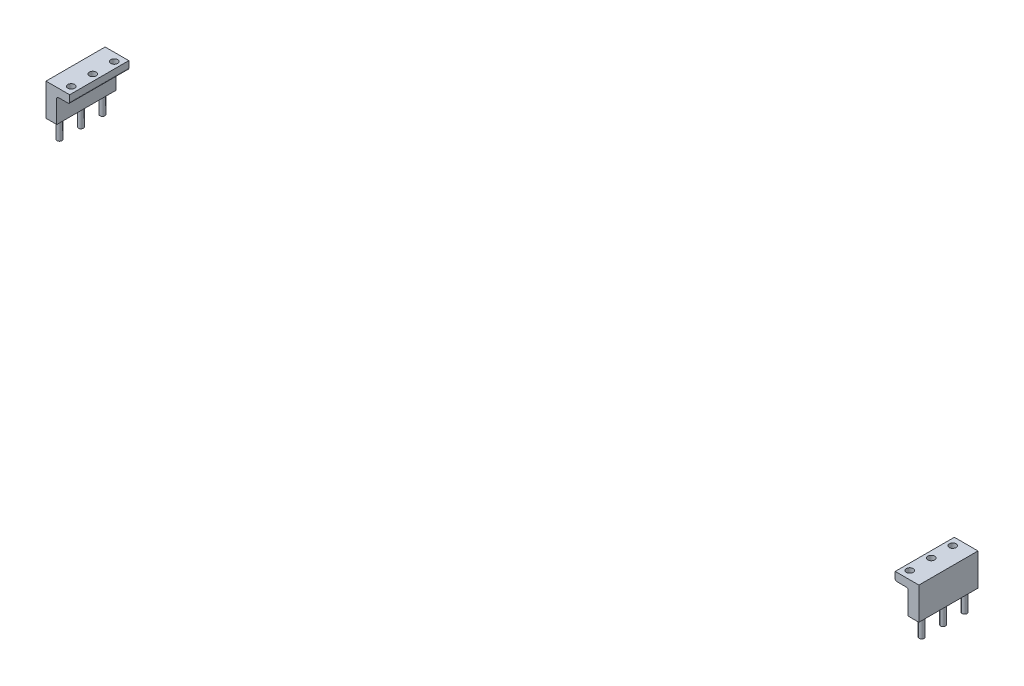
ISO-10303-21;
HEADER;
FILE_DESCRIPTION(('STEP AP214'),'2;1');
FILE_NAME('part.step','',(''),(''),'','','');
FILE_SCHEMA(('AUTOMOTIVE_DESIGN { 1 0 10303 214 1 1 1 1 }'));
ENDSEC;
DATA;
#1=APPLICATION_CONTEXT('core data for automotive mechanical design processes');
#2=APPLICATION_PROTOCOL_DEFINITION('international standard','automotive_design',2000,#1);
#3=PRODUCT_CONTEXT('',#1,'mechanical');
#4=PRODUCT('Part','Part','',(#3));
#5=PRODUCT_RELATED_PRODUCT_CATEGORY('part','',(#4));
#6=PRODUCT_DEFINITION_FORMATION('','',#4);
#7=PRODUCT_DEFINITION_CONTEXT('part definition',#1,'design');
#8=PRODUCT_DEFINITION('design','',#6,#7);
#9=PRODUCT_DEFINITION_SHAPE('','',#8);
#10=(LENGTH_UNIT() NAMED_UNIT(*) SI_UNIT(.MILLI.,.METRE.));
#11=(NAMED_UNIT(*) PLANE_ANGLE_UNIT() SI_UNIT($,.RADIAN.));
#12=(NAMED_UNIT(*) SI_UNIT($,.STERADIAN.) SOLID_ANGLE_UNIT());
#13=UNCERTAINTY_MEASURE_WITH_UNIT(LENGTH_MEASURE(1.E-05),#10,'distance_accuracy_value','');
#14=(GEOMETRIC_REPRESENTATION_CONTEXT(3) GLOBAL_UNCERTAINTY_ASSIGNED_CONTEXT((#13)) GLOBAL_UNIT_ASSIGNED_CONTEXT((#10,
#11,#12)) REPRESENTATION_CONTEXT('',''));
#15=CARTESIAN_POINT('',(0.,0.,0.));
#16=DIRECTION('',(0.,0.,1.));
#17=DIRECTION('',(1.,0.,0.));
#18=AXIS2_PLACEMENT_3D('',#15,#16,#17);
#19=CARTESIAN_POINT('',(514.25475,-81.3562,76.2));
#20=DIRECTION('',(0.,1.,0.));
#21=DIRECTION('',(0.,0.,1.));
#22=AXIS2_PLACEMENT_3D('',#19,#20,#21);
#23=PLANE('',#22);
#24=CARTESIAN_POINT('',(514.985,-81.3562,76.2));
#25=DIRECTION('',(0.,1.,0.));
#26=DIRECTION('',(0.,0.,-1.));
#27=AXIS2_PLACEMENT_3D('',#24,#25,#26);
#28=CIRCLE('',#27,1.4605);
#29=CARTESIAN_POINT('',(514.985,-81.3562,74.7395));
#30=VERTEX_POINT('',#29);
#31=EDGE_CURVE('P0_E11',#30,#30,#28,.T.);
#32=ORIENTED_EDGE('',*,*,#31,.F.);
#33=EDGE_LOOP('',(#32));
#34=FACE_BOUND('',#33,.T.);
#35=ADVANCED_FACE('P0_F17',(#34),#23,.F.);
#36=CARTESIAN_POINT('',(514.985,-75.6031,76.2));
#37=DIRECTION('',(0.,-1.,0.));
#38=DIRECTION('',(0.,0.,-1.));
#39=AXIS2_PLACEMENT_3D('',#36,#37,#38);
#40=CYLINDRICAL_SURFACE('',#39,1.4605);
#41=ORIENTED_EDGE('',*,*,#31,.T.);
#42=EDGE_LOOP('',(#41));
#43=FACE_BOUND('',#42,.T.);
#44=CARTESIAN_POINT('',(514.985,-71.12,76.2));
#45=DIRECTION('',(0.,1.,0.));
#46=DIRECTION('',(0.,0.,-1.));
#47=AXIS2_PLACEMENT_3D('',#44,#45,#46);
#48=CIRCLE('',#47,1.4605);
#49=CARTESIAN_POINT('',(514.985,-71.12,74.7395));
#50=VERTEX_POINT('',#49);
#51=EDGE_CURVE('P0_E164',#50,#50,#48,.T.);
#52=ORIENTED_EDGE('',*,*,#51,.F.);
#53=EDGE_LOOP('',(#52));
#54=FACE_BOUND('',#53,.T.);
#55=ADVANCED_FACE('P0_F175',(#43,#54),#40,.T.);
#56=CARTESIAN_POINT('',(514.985,-69.85,76.2));
#57=DIRECTION('',(0.,1.,0.));
#58=DIRECTION('',(0.,0.,1.));
#59=AXIS2_PLACEMENT_3D('',#56,#57,#58);
#60=CONICAL_SURFACE('',#59,2.7686,0.800175412804941);
#61=ORIENTED_EDGE('',*,*,#51,.T.);
#62=EDGE_LOOP('',(#61));
#63=FACE_BOUND('',#62,.T.);
#64=CARTESIAN_POINT('',(514.985,-69.85,76.2));
#65=DIRECTION('',(0.,1.,0.));
#66=DIRECTION('',(0.,0.,-1.));
#67=AXIS2_PLACEMENT_3D('',#64,#65,#66);
#68=CIRCLE('',#67,2.7686);
#69=CARTESIAN_POINT('',(514.985,-69.85,73.4314));
#70=VERTEX_POINT('',#69);
#71=EDGE_CURVE('P0_E24',#70,#70,#68,.T.);
#72=ORIENTED_EDGE('',*,*,#71,.F.);
#73=EDGE_LOOP('',(#72));
#74=FACE_BOUND('',#73,.T.);
#75=ADVANCED_FACE('P0_F172',(#63,#74),#60,.T.);
#76=CARTESIAN_POINT('',(514.25475,-81.3562,88.9));
#77=DIRECTION('',(0.,1.,0.));
#78=DIRECTION('',(0.,0.,1.));
#79=AXIS2_PLACEMENT_3D('',#76,#77,#78);
#80=PLANE('',#79);
#81=CARTESIAN_POINT('',(514.985,-81.3562,88.9));
#82=DIRECTION('',(0.,1.,0.));
#83=DIRECTION('',(0.,0.,-1.));
#84=AXIS2_PLACEMENT_3D('',#81,#82,#83);
#85=CIRCLE('',#84,1.4605);
#86=CARTESIAN_POINT('',(514.985,-81.3562,87.4395));
#87=VERTEX_POINT('',#86);
#88=EDGE_CURVE('P0_E161',#87,#87,#85,.T.);
#89=ORIENTED_EDGE('',*,*,#88,.F.);
#90=EDGE_LOOP('',(#89));
#91=FACE_BOUND('',#90,.T.);
#92=ADVANCED_FACE('P0_F174',(#91),#80,.F.);
#93=CARTESIAN_POINT('',(514.985,-75.6031,88.9));
#94=DIRECTION('',(0.,-1.,0.));
#95=DIRECTION('',(0.,0.,-1.));
#96=AXIS2_PLACEMENT_3D('',#93,#94,#95);
#97=CYLINDRICAL_SURFACE('',#96,1.4605);
#98=ORIENTED_EDGE('',*,*,#88,.T.);
#99=EDGE_LOOP('',(#98));
#100=FACE_BOUND('',#99,.T.);
#101=CARTESIAN_POINT('',(514.985,-71.12,88.9));
#102=DIRECTION('',(0.,1.,0.));
#103=DIRECTION('',(0.,0.,-1.));
#104=AXIS2_PLACEMENT_3D('',#101,#102,#103);
#105=CIRCLE('',#104,1.4605);
#106=CARTESIAN_POINT('',(514.985,-71.12,87.4395));
#107=VERTEX_POINT('',#106);
#108=EDGE_CURVE('P0_E155',#107,#107,#105,.T.);
#109=ORIENTED_EDGE('',*,*,#108,.F.);
#110=EDGE_LOOP('',(#109));
#111=FACE_BOUND('',#110,.T.);
#112=ADVANCED_FACE('P0_F183',(#100,#111),#97,.T.);
#113=CARTESIAN_POINT('',(514.985,-69.85,88.9));
#114=DIRECTION('',(0.,1.,0.));
#115=DIRECTION('',(0.,0.,1.));
#116=AXIS2_PLACEMENT_3D('',#113,#114,#115);
#117=CONICAL_SURFACE('',#116,2.7686,0.800175412804941);
#118=ORIENTED_EDGE('',*,*,#108,.T.);
#119=EDGE_LOOP('',(#118));
#120=FACE_BOUND('',#119,.T.);
#121=CARTESIAN_POINT('',(514.985,-69.85,88.9));
#122=DIRECTION('',(0.,1.,0.));
#123=DIRECTION('',(0.,0.,-1.));
#124=AXIS2_PLACEMENT_3D('',#121,#122,#123);
#125=CIRCLE('',#124,2.7686);
#126=CARTESIAN_POINT('',(514.985,-69.85,86.1314));
#127=VERTEX_POINT('',#126);
#128=EDGE_CURVE('P0_E158',#127,#127,#125,.T.);
#129=ORIENTED_EDGE('',*,*,#128,.F.);
#130=EDGE_LOOP('',(#129));
#131=FACE_BOUND('',#130,.T.);
#132=ADVANCED_FACE('P0_F216',(#120,#131),#117,.T.);
#133=CARTESIAN_POINT('',(504.19,-53.18125,106.3625));
#134=DIRECTION('',(1.,0.,0.));
#135=DIRECTION('',(0.,0.,1.));
#136=AXIS2_PLACEMENT_3D('',#133,#134,#135);
#137=PLANE('',#136);
#138=DIRECTION('',(0.,1.,0.));
#139=VECTOR('',#138,1.);
#140=CARTESIAN_POINT('',(504.19,-53.18125,106.3625));
#141=LINE('',#140,#139);
#142=CARTESIAN_POINT('',(504.19,-54.7243,106.3625));
#143=VERTEX_POINT('',#142);
#144=CARTESIAN_POINT('',(504.19,-50.8,106.3625));
#145=VERTEX_POINT('',#144);
#146=EDGE_CURVE('P0_E82',#143,#145,#141,.T.);
#147=ORIENTED_EDGE('',*,*,#146,.T.);
#148=DIRECTION('',(0.,0.,-1.));
#149=VECTOR('',#148,1.);
#150=CARTESIAN_POINT('',(504.19,-50.8,106.3625));
#151=LINE('',#150,#149);
#152=CARTESIAN_POINT('',(504.19,-50.8,71.4375));
#153=VERTEX_POINT('',#152);
#154=EDGE_CURVE('P0_E90',#145,#153,#151,.T.);
#155=ORIENTED_EDGE('',*,*,#154,.T.);
#156=DIRECTION('',(0.,1.,0.));
#157=VECTOR('',#156,1.);
#158=CARTESIAN_POINT('',(504.19,-53.18125,71.4375));
#159=LINE('',#158,#157);
#160=CARTESIAN_POINT('',(504.19,-54.7243,71.4375));
#161=VERTEX_POINT('',#160);
#162=EDGE_CURVE('P0_E123',#161,#153,#159,.T.);
#163=ORIENTED_EDGE('',*,*,#162,.F.);
#164=DIRECTION('',(0.,0.,-1.));
#165=VECTOR('',#164,1.);
#166=CARTESIAN_POINT('',(504.19,-54.7243,106.3625));
#167=LINE('',#166,#165);
#168=EDGE_CURVE('P0_E97',#143,#161,#167,.T.);
#169=ORIENTED_EDGE('',*,*,#168,.F.);
#170=EDGE_LOOP('',(#147,#155,#163,#169));
#171=FACE_BOUND('',#170,.T.);
#172=ADVANCED_FACE('P0_F101',(#171),#137,.F.);
#173=CARTESIAN_POINT('',(511.175,-50.8,106.3625));
#174=DIRECTION('',(0.,-1.,0.));
#175=DIRECTION('',(0.,0.,-1.));
#176=AXIS2_PLACEMENT_3D('',#173,#174,#175);
#177=PLANE('',#176);
#178=CARTESIAN_POINT('',(508.,-50.8,101.6));
#179=DIRECTION('',(0.,1.,0.));
#180=DIRECTION('',(0.,0.,-1.));
#181=AXIS2_PLACEMENT_3D('',#178,#179,#180);
#182=CIRCLE('',#181,1.9939);
#183=CARTESIAN_POINT('',(508.,-50.8,99.6061));
#184=VERTEX_POINT('',#183);
#185=EDGE_CURVE('P0_E109',#184,#184,#182,.T.);
#186=ORIENTED_EDGE('',*,*,#185,.F.);
#187=EDGE_LOOP('',(#186));
#188=FACE_BOUND('',#187,.T.);
#189=CARTESIAN_POINT('',(508.,-50.8,88.9));
#190=DIRECTION('',(0.,1.,0.));
#191=DIRECTION('',(0.,0.,-1.));
#192=AXIS2_PLACEMENT_3D('',#189,#190,#191);
#193=CIRCLE('',#192,1.9939);
#194=CARTESIAN_POINT('',(508.,-50.8,86.9061));
#195=VERTEX_POINT('',#194);
#196=EDGE_CURVE('P0_E371',#195,#195,#193,.T.);
#197=ORIENTED_EDGE('',*,*,#196,.F.);
#198=EDGE_LOOP('',(#197));
#199=FACE_BOUND('',#198,.T.);
#200=CARTESIAN_POINT('',(508.,-50.8,76.2));
#201=DIRECTION('',(0.,1.,0.));
#202=DIRECTION('',(0.,0.,-1.));
#203=AXIS2_PLACEMENT_3D('',#200,#201,#202);
#204=CIRCLE('',#203,1.9939);
#205=CARTESIAN_POINT('',(508.,-50.8,74.2061));
#206=VERTEX_POINT('',#205);
#207=EDGE_CURVE('P0_E364',#206,#206,#204,.T.);
#208=ORIENTED_EDGE('',*,*,#207,.F.);
#209=EDGE_LOOP('',(#208));
#210=FACE_BOUND('',#209,.T.);
#211=DIRECTION('',(1.,0.,0.));
#212=VECTOR('',#211,1.);
#213=CARTESIAN_POINT('',(511.175,-50.8,71.4375));
#214=LINE('',#213,#212);
#215=CARTESIAN_POINT('',(518.16,-50.8,71.4375));
#216=VERTEX_POINT('',#215);
#217=EDGE_CURVE('P0_E93',#153,#216,#214,.T.);
#218=ORIENTED_EDGE('',*,*,#217,.F.);
#219=ORIENTED_EDGE('',*,*,#154,.F.);
#220=DIRECTION('',(1.,0.,0.));
#221=VECTOR('',#220,1.);
#222=CARTESIAN_POINT('',(511.175,-50.8,106.3625));
#223=LINE('',#222,#221);
#224=CARTESIAN_POINT('',(518.16,-50.8,106.3625));
#225=VERTEX_POINT('',#224);
#226=EDGE_CURVE('P0_E78',#145,#225,#223,.T.);
#227=ORIENTED_EDGE('',*,*,#226,.T.);
#228=DIRECTION('',(0.,0.,-1.));
#229=VECTOR('',#228,1.);
#230=CARTESIAN_POINT('',(518.16,-50.8,106.3625));
#231=LINE('',#230,#229);
#232=EDGE_CURVE('P0_E98',#225,#216,#231,.T.);
#233=ORIENTED_EDGE('',*,*,#232,.T.);
#234=EDGE_LOOP('',(#218,#219,#227,#233));
#235=FACE_BOUND('',#234,.T.);
#236=ADVANCED_FACE('P0_F91',(#188,#199,#210,#235),#177,.F.);
#237=CARTESIAN_POINT('',(518.16,-60.325,106.3625));
#238=DIRECTION('',(-1.,0.,0.));
#239=DIRECTION('',(0.,1.,0.));
#240=AXIS2_PLACEMENT_3D('',#237,#238,#239);
#241=PLANE('',#240);
#242=DIRECTION('',(0.,-1.,0.));
#243=VECTOR('',#242,1.);
#244=CARTESIAN_POINT('',(518.16,-60.325,71.4375));
#245=LINE('',#244,#243);
#246=CARTESIAN_POINT('',(518.16,-69.85,71.4375));
#247=VERTEX_POINT('',#246);
#248=EDGE_CURVE('P0_E126',#216,#247,#245,.T.);
#249=ORIENTED_EDGE('',*,*,#248,.F.);
#250=ORIENTED_EDGE('',*,*,#232,.F.);
#251=DIRECTION('',(0.,-1.,0.));
#252=VECTOR('',#251,1.);
#253=CARTESIAN_POINT('',(518.16,-60.325,106.3625));
#254=LINE('',#253,#252);
#255=CARTESIAN_POINT('',(518.16,-69.85,106.3625));
#256=VERTEX_POINT('',#255);
#257=EDGE_CURVE('P0_E84',#225,#256,#254,.T.);
#258=ORIENTED_EDGE('',*,*,#257,.T.);
#259=DIRECTION('',(0.,0.,-1.));
#260=VECTOR('',#259,1.);
#261=CARTESIAN_POINT('',(518.16,-69.85,106.3625));
#262=LINE('',#261,#260);
#263=EDGE_CURVE('P0_E136',#256,#247,#262,.T.);
#264=ORIENTED_EDGE('',*,*,#263,.T.);
#265=EDGE_LOOP('',(#249,#250,#258,#264));
#266=FACE_BOUND('',#265,.T.);
#267=ADVANCED_FACE('P0_F237',(#266),#241,.F.);
#268=CARTESIAN_POINT('',(514.985,-69.85,106.3625));
#269=DIRECTION('',(0.,1.,0.));
#270=DIRECTION('',(0.,0.,1.));
#271=AXIS2_PLACEMENT_3D('',#268,#269,#270);
#272=PLANE('',#271);
#273=ORIENTED_EDGE('',*,*,#71,.T.);
#274=EDGE_LOOP('',(#273));
#275=FACE_BOUND('',#274,.T.);
#276=ORIENTED_EDGE('',*,*,#128,.T.);
#277=EDGE_LOOP('',(#276));
#278=FACE_BOUND('',#277,.T.);
#279=CARTESIAN_POINT('',(514.985,-69.85,101.6));
#280=DIRECTION('',(0.,1.,0.));
#281=DIRECTION('',(0.,0.,-1.));
#282=AXIS2_PLACEMENT_3D('',#279,#280,#281);
#283=CIRCLE('',#282,2.7686);
#284=CARTESIAN_POINT('',(514.985,-69.85,98.8314));
#285=VERTEX_POINT('',#284);
#286=EDGE_CURVE('P0_E154',#285,#285,#283,.T.);
#287=ORIENTED_EDGE('',*,*,#286,.T.);
#288=EDGE_LOOP('',(#287));
#289=FACE_BOUND('',#288,.T.);
#290=DIRECTION('',(-1.,0.,0.));
#291=VECTOR('',#290,1.);
#292=CARTESIAN_POINT('',(514.985,-69.85,71.4375));
#293=LINE('',#292,#291);
#294=CARTESIAN_POINT('',(511.81,-69.85,71.4375));
#295=VERTEX_POINT('',#294);
#296=EDGE_CURVE('P0_E129',#247,#295,#293,.T.);
#297=ORIENTED_EDGE('',*,*,#296,.F.);
#298=ORIENTED_EDGE('',*,*,#263,.F.);
#299=DIRECTION('',(-1.,0.,0.));
#300=VECTOR('',#299,1.);
#301=CARTESIAN_POINT('',(514.985,-69.85,106.3625));
#302=LINE('',#301,#300);
#303=CARTESIAN_POINT('',(511.81,-69.85,106.3625));
#304=VERTEX_POINT('',#303);
#305=EDGE_CURVE('P0_E113',#256,#304,#302,.T.);
#306=ORIENTED_EDGE('',*,*,#305,.T.);
#307=DIRECTION('',(0.,0.,-1.));
#308=VECTOR('',#307,1.);
#309=CARTESIAN_POINT('',(511.81,-69.85,106.3625));
#310=LINE('',#309,#308);
#311=EDGE_CURVE('P0_E122',#304,#295,#310,.T.);
#312=ORIENTED_EDGE('',*,*,#311,.T.);
#313=EDGE_LOOP('',(#297,#298,#306,#312));
#314=FACE_BOUND('',#313,.T.);
#315=ADVANCED_FACE('P0_F169',(#275,#278,#289,#314),#272,.F.);
#316=CARTESIAN_POINT('',(511.81,-62.70625,106.3625));
#317=DIRECTION('',(1.,0.,0.));
#318=DIRECTION('',(0.,0.,1.));
#319=AXIS2_PLACEMENT_3D('',#316,#317,#318);
#320=PLANE('',#319);
#321=DIRECTION('',(0.,1.,0.));
#322=VECTOR('',#321,1.);
#323=CARTESIAN_POINT('',(511.81,-62.70625,71.4375));
#324=LINE('',#323,#322);
#325=CARTESIAN_POINT('',(511.81,-56.4007,71.4375));
#326=VERTEX_POINT('',#325);
#327=EDGE_CURVE('P0_E106',#295,#326,#324,.T.);
#328=ORIENTED_EDGE('',*,*,#327,.F.);
#329=ORIENTED_EDGE('',*,*,#311,.F.);
#330=DIRECTION('',(0.,1.,0.));
#331=VECTOR('',#330,1.);
#332=CARTESIAN_POINT('',(511.81,-62.70625,106.3625));
#333=LINE('',#332,#331);
#334=CARTESIAN_POINT('',(511.81,-56.4007,106.3625));
#335=VERTEX_POINT('',#334);
#336=EDGE_CURVE('P0_E116',#304,#335,#333,.T.);
#337=ORIENTED_EDGE('',*,*,#336,.T.);
#338=DIRECTION('',(0.,0.,-1.));
#339=VECTOR('',#338,1.);
#340=CARTESIAN_POINT('',(511.81,-56.4007,106.3625));
#341=LINE('',#340,#339);
#342=EDGE_CURVE('P0_E149',#326,#335,#341,.F.);
#343=ORIENTED_EDGE('',*,*,#342,.F.);
#344=EDGE_LOOP('',(#328,#329,#337,#343));
#345=FACE_BOUND('',#344,.T.);
#346=ADVANCED_FACE('P0_F252',(#345),#320,.F.);
#347=CARTESIAN_POINT('',(508.,-55.5625,106.3625));
#348=DIRECTION('',(0.,1.,0.));
#349=DIRECTION('',(0.,0.,1.));
#350=AXIS2_PLACEMENT_3D('',#347,#348,#349);
#351=PLANE('',#350);
#352=CARTESIAN_POINT('',(508.,-55.5625,101.6));
#353=DIRECTION('',(0.,1.,0.));
#354=DIRECTION('',(0.,0.,-1.));
#355=AXIS2_PLACEMENT_3D('',#352,#353,#354);
#356=CIRCLE('',#355,1.9939);
#357=CARTESIAN_POINT('',(508.,-55.5625,99.6061));
#358=VERTEX_POINT('',#357);
#359=EDGE_CURVE('P0_E361',#358,#358,#356,.T.);
#360=ORIENTED_EDGE('',*,*,#359,.T.);
#361=EDGE_LOOP('',(#360));
#362=FACE_BOUND('',#361,.T.);
#363=CARTESIAN_POINT('',(508.,-55.5625,88.9));
#364=DIRECTION('',(0.,1.,0.));
#365=DIRECTION('',(0.,0.,-1.));
#366=AXIS2_PLACEMENT_3D('',#363,#364,#365);
#367=CIRCLE('',#366,1.9939);
#368=CARTESIAN_POINT('',(508.,-55.5625,86.9061));
#369=VERTEX_POINT('',#368);
#370=EDGE_CURVE('P0_E365',#369,#369,#367,.T.);
#371=ORIENTED_EDGE('',*,*,#370,.T.);
#372=EDGE_LOOP('',(#371));
#373=FACE_BOUND('',#372,.T.);
#374=CARTESIAN_POINT('',(508.,-55.5625,76.2));
#375=DIRECTION('',(0.,1.,0.));
#376=DIRECTION('',(0.,0.,-1.));
#377=AXIS2_PLACEMENT_3D('',#374,#375,#376);
#378=CIRCLE('',#377,1.9939);
#379=CARTESIAN_POINT('',(508.,-55.5625,74.2061));
#380=VERTEX_POINT('',#379);
#381=EDGE_CURVE('P0_E360',#380,#380,#378,.T.);
#382=ORIENTED_EDGE('',*,*,#381,.T.);
#383=EDGE_LOOP('',(#382));
#384=FACE_BOUND('',#383,.T.);
#385=DIRECTION('',(-1.,0.,0.));
#386=VECTOR('',#385,1.);
#387=CARTESIAN_POINT('',(508.,-55.5625,71.4375));
#388=LINE('',#387,#386);
#389=CARTESIAN_POINT('',(510.9718,-55.5625,71.4375));
#390=VERTEX_POINT('',#389);
#391=CARTESIAN_POINT('',(505.0282,-55.5625,71.4375));
#392=VERTEX_POINT('',#391);
#393=EDGE_CURVE('P0_E103',#390,#392,#388,.T.);
#394=ORIENTED_EDGE('',*,*,#393,.F.);
#395=DIRECTION('',(0.,0.,-1.));
#396=VECTOR('',#395,1.);
#397=CARTESIAN_POINT('',(510.9718,-55.5625,71.4375));
#398=LINE('',#397,#396);
#399=CARTESIAN_POINT('',(510.9718,-55.5625,106.3625));
#400=VERTEX_POINT('',#399);
#401=EDGE_CURVE('P0_E143',#400,#390,#398,.T.);
#402=ORIENTED_EDGE('',*,*,#401,.F.);
#403=DIRECTION('',(-1.,0.,0.));
#404=VECTOR('',#403,1.);
#405=CARTESIAN_POINT('',(508.,-55.5625,106.3625));
#406=LINE('',#405,#404);
#407=CARTESIAN_POINT('',(505.0282,-55.5625,106.3625));
#408=VERTEX_POINT('',#407);
#409=EDGE_CURVE('P0_E119',#400,#408,#406,.T.);
#410=ORIENTED_EDGE('',*,*,#409,.T.);
#411=DIRECTION('',(0.,0.,-1.));
#412=VECTOR('',#411,1.);
#413=CARTESIAN_POINT('',(505.0282,-55.5625,106.3625));
#414=LINE('',#413,#412);
#415=EDGE_CURVE('P0_E146',#392,#408,#414,.F.);
#416=ORIENTED_EDGE('',*,*,#415,.F.);
#417=EDGE_LOOP('',(#394,#402,#410,#416));
#418=FACE_BOUND('',#417,.T.);
#419=ADVANCED_FACE('P0_F259',(#362,#373,#384,#418),#351,.F.);
#420=CARTESIAN_POINT('',(511.175,-60.325,106.3625));
#421=DIRECTION('',(0.,0.,1.));
#422=DIRECTION('',(-1.,0.,0.));
#423=AXIS2_PLACEMENT_3D('',#420,#421,#422);
#424=PLANE('',#423);
#425=ORIENTED_EDGE('',*,*,#409,.F.);
#426=CARTESIAN_POINT('',(510.9718,-56.4007,106.3625));
#427=DIRECTION('',(0.,0.,-1.));
#428=DIRECTION('',(-1.,0.,0.));
#429=AXIS2_PLACEMENT_3D('',#426,#427,#428);
#430=CIRCLE('',#429,0.8382);
#431=EDGE_CURVE('P0_E31',#335,#400,#430,.F.);
#432=ORIENTED_EDGE('',*,*,#431,.F.);
#433=ORIENTED_EDGE('',*,*,#336,.F.);
#434=ORIENTED_EDGE('',*,*,#305,.F.);
#435=ORIENTED_EDGE('',*,*,#257,.F.);
#436=ORIENTED_EDGE('',*,*,#226,.F.);
#437=ORIENTED_EDGE('',*,*,#146,.F.);
#438=CARTESIAN_POINT('',(505.0282,-54.7243,106.3625));
#439=DIRECTION('',(0.,0.,-1.));
#440=DIRECTION('',(-1.,0.,0.));
#441=AXIS2_PLACEMENT_3D('',#438,#439,#440);
#442=CIRCLE('',#441,0.8382);
#443=EDGE_CURVE('P0_E37',#408,#143,#442,.T.);
#444=ORIENTED_EDGE('',*,*,#443,.F.);
#445=EDGE_LOOP('',(#425,#432,#433,#434,#435,#436,#437,#444));
#446=FACE_BOUND('',#445,.T.);
#447=ADVANCED_FACE('P0_F80',(#446),#424,.T.);
#448=CARTESIAN_POINT('',(511.175,-60.325,71.4375));
#449=DIRECTION('',(0.,0.,1.));
#450=DIRECTION('',(-1.,0.,0.));
#451=AXIS2_PLACEMENT_3D('',#448,#449,#450);
#452=PLANE('',#451);
#453=ORIENTED_EDGE('',*,*,#162,.T.);
#454=ORIENTED_EDGE('',*,*,#217,.T.);
#455=ORIENTED_EDGE('',*,*,#248,.T.);
#456=ORIENTED_EDGE('',*,*,#296,.T.);
#457=ORIENTED_EDGE('',*,*,#327,.T.);
#458=CARTESIAN_POINT('',(510.9718,-56.4007,71.4375));
#459=DIRECTION('',(0.,0.,-1.));
#460=DIRECTION('',(-1.,0.,0.));
#461=AXIS2_PLACEMENT_3D('',#458,#459,#460);
#462=CIRCLE('',#461,0.8382);
#463=EDGE_CURVE('P0_E151',#390,#326,#462,.T.);
#464=ORIENTED_EDGE('',*,*,#463,.F.);
#465=ORIENTED_EDGE('',*,*,#393,.T.);
#466=CARTESIAN_POINT('',(505.0282,-54.7243,71.4375));
#467=DIRECTION('',(0.,0.,-1.));
#468=DIRECTION('',(-1.,0.,0.));
#469=AXIS2_PLACEMENT_3D('',#466,#467,#468);
#470=CIRCLE('',#469,0.8382);
#471=EDGE_CURVE('P0_E141',#161,#392,#470,.F.);
#472=ORIENTED_EDGE('',*,*,#471,.F.);
#473=EDGE_LOOP('',(#453,#454,#455,#456,#457,#464,#465,#472));
#474=FACE_BOUND('',#473,.T.);
#475=ADVANCED_FACE('P0_F274',(#474),#452,.F.);
#476=CARTESIAN_POINT('',(508.,-30.1625,76.2));
#477=DIRECTION('',(0.,-1.,0.));
#478=DIRECTION('',(0.,0.,-1.));
#479=AXIS2_PLACEMENT_3D('',#476,#477,#478);
#480=CYLINDRICAL_SURFACE('',#479,1.9939);
#481=ORIENTED_EDGE('',*,*,#381,.F.);
#482=EDGE_LOOP('',(#481));
#483=FACE_BOUND('',#482,.T.);
#484=ORIENTED_EDGE('',*,*,#207,.T.);
#485=EDGE_LOOP('',(#484));
#486=FACE_BOUND('',#485,.T.);
#487=ADVANCED_FACE('P0_F281',(#483,#486),#480,.F.);
#488=CARTESIAN_POINT('',(508.,-30.1625,88.9));
#489=DIRECTION('',(0.,-1.,0.));
#490=DIRECTION('',(0.,0.,-1.));
#491=AXIS2_PLACEMENT_3D('',#488,#489,#490);
#492=CYLINDRICAL_SURFACE('',#491,1.9939);
#493=ORIENTED_EDGE('',*,*,#370,.F.);
#494=EDGE_LOOP('',(#493));
#495=FACE_BOUND('',#494,.T.);
#496=ORIENTED_EDGE('',*,*,#196,.T.);
#497=EDGE_LOOP('',(#496));
#498=FACE_BOUND('',#497,.T.);
#499=ADVANCED_FACE('P0_F289',(#495,#498),#492,.F.);
#500=CARTESIAN_POINT('',(508.,-30.1625,101.6));
#501=DIRECTION('',(0.,-1.,0.));
#502=DIRECTION('',(0.,0.,-1.));
#503=AXIS2_PLACEMENT_3D('',#500,#501,#502);
#504=CYLINDRICAL_SURFACE('',#503,1.9939);
#505=ORIENTED_EDGE('',*,*,#359,.F.);
#506=EDGE_LOOP('',(#505));
#507=FACE_BOUND('',#506,.T.);
#508=ORIENTED_EDGE('',*,*,#185,.T.);
#509=EDGE_LOOP('',(#508));
#510=FACE_BOUND('',#509,.T.);
#511=ADVANCED_FACE('P0_F297',(#507,#510),#504,.F.);
#512=CARTESIAN_POINT('',(505.0282,-54.7243,106.3625));
#513=DIRECTION('',(0.,0.,-1.));
#514=DIRECTION('',(1.,0.,0.));
#515=AXIS2_PLACEMENT_3D('',#512,#513,#514);
#516=CYLINDRICAL_SURFACE('',#515,0.8382);
#517=ORIENTED_EDGE('',*,*,#443,.T.);
#518=ORIENTED_EDGE('',*,*,#168,.T.);
#519=ORIENTED_EDGE('',*,*,#471,.T.);
#520=ORIENTED_EDGE('',*,*,#415,.T.);
#521=EDGE_LOOP('',(#517,#518,#519,#520));
#522=FACE_BOUND('',#521,.T.);
#523=ADVANCED_FACE('P0_F305',(#522),#516,.T.);
#524=CARTESIAN_POINT('',(510.9718,-56.4007,106.3625));
#525=DIRECTION('',(0.,0.,1.));
#526=DIRECTION('',(-1.,0.,0.));
#527=AXIS2_PLACEMENT_3D('',#524,#525,#526);
#528=CYLINDRICAL_SURFACE('',#527,0.8382);
#529=ORIENTED_EDGE('',*,*,#431,.T.);
#530=ORIENTED_EDGE('',*,*,#401,.T.);
#531=ORIENTED_EDGE('',*,*,#463,.T.);
#532=ORIENTED_EDGE('',*,*,#342,.T.);
#533=EDGE_LOOP('',(#529,#530,#531,#532));
#534=FACE_BOUND('',#533,.T.);
#535=ADVANCED_FACE('P0_F313',(#534),#528,.F.);
#536=CARTESIAN_POINT('',(514.25475,-81.3562,101.6));
#537=DIRECTION('',(0.,1.,0.));
#538=DIRECTION('',(0.,0.,1.));
#539=AXIS2_PLACEMENT_3D('',#536,#537,#538);
#540=PLANE('',#539);
#541=CARTESIAN_POINT('',(514.985,-81.3562,101.6));
#542=DIRECTION('',(0.,1.,0.));
#543=DIRECTION('',(0.,0.,-1.));
#544=AXIS2_PLACEMENT_3D('',#541,#542,#543);
#545=CIRCLE('',#544,1.4605);
#546=CARTESIAN_POINT('',(514.985,-81.3562,100.1395));
#547=VERTEX_POINT('',#546);
#548=EDGE_CURVE('P0_E357',#547,#547,#545,.T.);
#549=ORIENTED_EDGE('',*,*,#548,.F.);
#550=EDGE_LOOP('',(#549));
#551=FACE_BOUND('',#550,.T.);
#552=ADVANCED_FACE('P0_F321',(#551),#540,.F.);
#553=CARTESIAN_POINT('',(514.985,-75.6031,101.6));
#554=DIRECTION('',(0.,-1.,0.));
#555=DIRECTION('',(0.,0.,-1.));
#556=AXIS2_PLACEMENT_3D('',#553,#554,#555);
#557=CYLINDRICAL_SURFACE('',#556,1.4605);
#558=ORIENTED_EDGE('',*,*,#548,.T.);
#559=EDGE_LOOP('',(#558));
#560=FACE_BOUND('',#559,.T.);
#561=CARTESIAN_POINT('',(514.985,-71.12,101.6));
#562=DIRECTION('',(0.,1.,0.));
#563=DIRECTION('',(0.,0.,-1.));
#564=AXIS2_PLACEMENT_3D('',#561,#562,#563);
#565=CIRCLE('',#564,1.4605);
#566=CARTESIAN_POINT('',(514.985,-71.12,100.1395));
#567=VERTEX_POINT('',#566);
#568=EDGE_CURVE('P0_E350',#567,#567,#565,.T.);
#569=ORIENTED_EDGE('',*,*,#568,.F.);
#570=EDGE_LOOP('',(#569));
#571=FACE_BOUND('',#570,.T.);
#572=ADVANCED_FACE('P0_F329',(#560,#571),#557,.T.);
#573=CARTESIAN_POINT('',(514.985,-69.85,101.6));
#574=DIRECTION('',(0.,1.,0.));
#575=DIRECTION('',(0.,0.,1.));
#576=AXIS2_PLACEMENT_3D('',#573,#574,#575);
#577=CONICAL_SURFACE('',#576,2.7686,0.800175412804941);
#578=ORIENTED_EDGE('',*,*,#568,.T.);
#579=EDGE_LOOP('',(#578));
#580=FACE_BOUND('',#579,.T.);
#581=ORIENTED_EDGE('',*,*,#286,.F.);
#582=EDGE_LOOP('',(#581));
#583=FACE_BOUND('',#582,.T.);
#584=ADVANCED_FACE('P0_F337',(#580,#583),#577,.T.);
#585=CLOSED_SHELL('',(#35,#55,#75,#92,#112,#132,#172,#236,#267,#315,#346,#419,#447,#475,#487,
#499,#511,#523,#535,#552,#572,#584));
#586=MANIFOLD_SOLID_BREP('P0_B1',#585);
#587=CARTESIAN_POINT('',(6.44524999999978,-81.3562,76.2));
#588=DIRECTION('',(0.,1.,0.));
#589=DIRECTION('',(0.,0.,1.));
#590=AXIS2_PLACEMENT_3D('',#587,#588,#589);
#591=PLANE('',#590);
#592=CARTESIAN_POINT('',(5.71499999999978,-81.3562,76.2));
#593=DIRECTION('',(0.,-1.,0.));
#594=DIRECTION('',(0.,0.,-1.));
#595=AXIS2_PLACEMENT_3D('',#592,#593,#594);
#596=CIRCLE('',#595,1.4605);
#597=CARTESIAN_POINT('',(5.71499999999978,-81.3562,74.7395));
#598=VERTEX_POINT('',#597);
#599=EDGE_CURVE('P1_E11',#598,#598,#596,.T.);
#600=ORIENTED_EDGE('',*,*,#599,.T.);
#601=EDGE_LOOP('',(#600));
#602=FACE_BOUND('',#601,.T.);
#603=ADVANCED_FACE('P1_F17',(#602),#591,.F.);
#604=CARTESIAN_POINT('',(5.71499999999978,-75.6031,76.2));
#605=DIRECTION('',(0.,-1.,0.));
#606=DIRECTION('',(0.,0.,-1.));
#607=AXIS2_PLACEMENT_3D('',#604,#605,#606);
#608=CYLINDRICAL_SURFACE('',#607,1.4605);
#609=ORIENTED_EDGE('',*,*,#599,.F.);
#610=EDGE_LOOP('',(#609));
#611=FACE_BOUND('',#610,.T.);
#612=CARTESIAN_POINT('',(5.71499999999978,-71.12,76.2));
#613=DIRECTION('',(0.,-1.,0.));
#614=DIRECTION('',(0.,0.,-1.));
#615=AXIS2_PLACEMENT_3D('',#612,#613,#614);
#616=CIRCLE('',#615,1.4605);
#617=CARTESIAN_POINT('',(5.71499999999978,-71.12,74.7395));
#618=VERTEX_POINT('',#617);
#619=EDGE_CURVE('P1_E139',#618,#618,#616,.T.);
#620=ORIENTED_EDGE('',*,*,#619,.T.);
#621=EDGE_LOOP('',(#620));
#622=FACE_BOUND('',#621,.T.);
#623=ADVANCED_FACE('P1_F227',(#611,#622),#608,.T.);
#624=CARTESIAN_POINT('',(5.71499999999978,-69.85,76.2));
#625=DIRECTION('',(0.,1.,0.));
#626=DIRECTION('',(0.,0.,1.));
#627=AXIS2_PLACEMENT_3D('',#624,#625,#626);
#628=CONICAL_SURFACE('',#627,2.7686,0.800175412804941);
#629=ORIENTED_EDGE('',*,*,#619,.F.);
#630=EDGE_LOOP('',(#629));
#631=FACE_BOUND('',#630,.T.);
#632=CARTESIAN_POINT('',(5.71499999999978,-69.85,76.2));
#633=DIRECTION('',(0.,-1.,0.));
#634=DIRECTION('',(0.,0.,-1.));
#635=AXIS2_PLACEMENT_3D('',#632,#633,#634);
#636=CIRCLE('',#635,2.7686);
#637=CARTESIAN_POINT('',(5.71499999999978,-69.85,73.4314));
#638=VERTEX_POINT('',#637);
#639=EDGE_CURVE('P1_E24',#638,#638,#636,.T.);
#640=ORIENTED_EDGE('',*,*,#639,.T.);
#641=EDGE_LOOP('',(#640));
#642=FACE_BOUND('',#641,.T.);
#643=ADVANCED_FACE('P1_F144',(#631,#642),#628,.T.);
#644=CARTESIAN_POINT('',(6.44524999999978,-81.3562,88.9));
#645=DIRECTION('',(0.,1.,0.));
#646=DIRECTION('',(0.,0.,1.));
#647=AXIS2_PLACEMENT_3D('',#644,#645,#646);
#648=PLANE('',#647);
#649=CARTESIAN_POINT('',(5.71499999999978,-81.3562,88.9));
#650=DIRECTION('',(0.,-1.,0.));
#651=DIRECTION('',(0.,0.,-1.));
#652=AXIS2_PLACEMENT_3D('',#649,#650,#651);
#653=CIRCLE('',#652,1.4605);
#654=CARTESIAN_POINT('',(5.71499999999978,-81.3562,87.4395));
#655=VERTEX_POINT('',#654);
#656=EDGE_CURVE('P1_E136',#655,#655,#653,.T.);
#657=ORIENTED_EDGE('',*,*,#656,.T.);
#658=EDGE_LOOP('',(#657));
#659=FACE_BOUND('',#658,.T.);
#660=ADVANCED_FACE('P1_F238',(#659),#648,.F.);
#661=CARTESIAN_POINT('',(5.71499999999978,-75.6031,88.9));
#662=DIRECTION('',(0.,-1.,0.));
#663=DIRECTION('',(0.,0.,-1.));
#664=AXIS2_PLACEMENT_3D('',#661,#662,#663);
#665=CYLINDRICAL_SURFACE('',#664,1.4605);
#666=ORIENTED_EDGE('',*,*,#656,.F.);
#667=EDGE_LOOP('',(#666));
#668=FACE_BOUND('',#667,.T.);
#669=CARTESIAN_POINT('',(5.71499999999978,-71.12,88.9));
#670=DIRECTION('',(0.,-1.,0.));
#671=DIRECTION('',(0.,0.,-1.));
#672=AXIS2_PLACEMENT_3D('',#669,#670,#671);
#673=CIRCLE('',#672,1.4605);
#674=CARTESIAN_POINT('',(5.71499999999978,-71.12,87.4395));
#675=VERTEX_POINT('',#674);
#676=EDGE_CURVE('P1_E130',#675,#675,#673,.T.);
#677=ORIENTED_EDGE('',*,*,#676,.T.);
#678=EDGE_LOOP('',(#677));
#679=FACE_BOUND('',#678,.T.);
#680=ADVANCED_FACE('P1_F243',(#668,#679),#665,.T.);
#681=CARTESIAN_POINT('',(5.71499999999978,-69.85,88.9));
#682=DIRECTION('',(0.,1.,0.));
#683=DIRECTION('',(0.,0.,1.));
#684=AXIS2_PLACEMENT_3D('',#681,#682,#683);
#685=CONICAL_SURFACE('',#684,2.7686,0.800175412804941);
#686=ORIENTED_EDGE('',*,*,#676,.F.);
#687=EDGE_LOOP('',(#686));
#688=FACE_BOUND('',#687,.T.);
#689=CARTESIAN_POINT('',(5.71499999999978,-69.85,88.9));
#690=DIRECTION('',(0.,-1.,0.));
#691=DIRECTION('',(0.,0.,-1.));
#692=AXIS2_PLACEMENT_3D('',#689,#690,#691);
#693=CIRCLE('',#692,2.7686);
#694=CARTESIAN_POINT('',(5.71499999999978,-69.85,86.1314));
#695=VERTEX_POINT('',#694);
#696=EDGE_CURVE('P1_E133',#695,#695,#693,.T.);
#697=ORIENTED_EDGE('',*,*,#696,.T.);
#698=EDGE_LOOP('',(#697));
#699=FACE_BOUND('',#698,.T.);
#700=ADVANCED_FACE('P1_F249',(#688,#699),#685,.T.);
#701=CARTESIAN_POINT('',(16.51,-53.18125,106.3625));
#702=DIRECTION('',(-1.,0.,0.));
#703=DIRECTION('',(0.,0.,1.));
#704=AXIS2_PLACEMENT_3D('',#701,#702,#703);
#705=PLANE('',#704);
#706=DIRECTION('',(0.,1.,0.));
#707=VECTOR('',#706,1.);
#708=CARTESIAN_POINT('',(16.51,-53.18125,106.3625));
#709=LINE('',#708,#707);
#710=CARTESIAN_POINT('',(16.51,-54.7243,106.3625));
#711=VERTEX_POINT('',#710);
#712=CARTESIAN_POINT('',(16.51,-50.8,106.3625));
#713=VERTEX_POINT('',#712);
#714=EDGE_CURVE('P1_E84',#711,#713,#709,.T.);
#715=ORIENTED_EDGE('',*,*,#714,.F.);
#716=DIRECTION('',(0.,0.,-1.));
#717=VECTOR('',#716,1.);
#718=CARTESIAN_POINT('',(16.51,-54.7243,106.3625));
#719=LINE('',#718,#717);
#720=CARTESIAN_POINT('',(16.51,-54.7243,71.4375));
#721=VERTEX_POINT('',#720);
#722=EDGE_CURVE('P1_E110',#711,#721,#719,.T.);
#723=ORIENTED_EDGE('',*,*,#722,.T.);
#724=DIRECTION('',(0.,1.,0.));
#725=VECTOR('',#724,1.);
#726=CARTESIAN_POINT('',(16.51,-53.18125,71.4375));
#727=LINE('',#726,#725);
#728=CARTESIAN_POINT('',(16.51,-50.8,71.4375));
#729=VERTEX_POINT('',#728);
#730=EDGE_CURVE('P1_E108',#721,#729,#727,.T.);
#731=ORIENTED_EDGE('',*,*,#730,.T.);
#732=DIRECTION('',(0.,0.,-1.));
#733=VECTOR('',#732,1.);
#734=CARTESIAN_POINT('',(16.51,-50.8,106.3625));
#735=LINE('',#734,#733);
#736=EDGE_CURVE('P1_E100',#713,#729,#735,.T.);
#737=ORIENTED_EDGE('',*,*,#736,.F.);
#738=EDGE_LOOP('',(#715,#723,#731,#737));
#739=FACE_BOUND('',#738,.T.);
#740=ADVANCED_FACE('P1_F106',(#739),#705,.F.);
#741=CARTESIAN_POINT('',(9.52499999999978,-50.8,106.3625));
#742=DIRECTION('',(0.,-1.,0.));
#743=DIRECTION('',(0.,0.,-1.));
#744=AXIS2_PLACEMENT_3D('',#741,#742,#743);
#745=PLANE('',#744);
#746=CARTESIAN_POINT('',(12.6999999999998,-50.8,101.6));
#747=DIRECTION('',(0.,-1.,0.));
#748=DIRECTION('',(0.,0.,-1.));
#749=AXIS2_PLACEMENT_3D('',#746,#747,#748);
#750=CIRCLE('',#749,1.9939);
#751=CARTESIAN_POINT('',(12.6999999999998,-50.8,99.6061));
#752=VERTEX_POINT('',#751);
#753=EDGE_CURVE('P1_E183',#752,#752,#750,.T.);
#754=ORIENTED_EDGE('',*,*,#753,.T.);
#755=EDGE_LOOP('',(#754));
#756=FACE_BOUND('',#755,.T.);
#757=CARTESIAN_POINT('',(12.6999999999998,-50.8,88.9));
#758=DIRECTION('',(0.,-1.,0.));
#759=DIRECTION('',(0.,0.,-1.));
#760=AXIS2_PLACEMENT_3D('',#757,#758,#759);
#761=CIRCLE('',#760,1.9939);
#762=CARTESIAN_POINT('',(12.6999999999998,-50.8,86.9061));
#763=VERTEX_POINT('',#762);
#764=EDGE_CURVE('P1_E191',#763,#763,#761,.T.);
#765=ORIENTED_EDGE('',*,*,#764,.T.);
#766=EDGE_LOOP('',(#765));
#767=FACE_BOUND('',#766,.T.);
#768=CARTESIAN_POINT('',(12.6999999999998,-50.8,76.2));
#769=DIRECTION('',(0.,-1.,0.));
#770=DIRECTION('',(0.,0.,-1.));
#771=AXIS2_PLACEMENT_3D('',#768,#769,#770);
#772=CIRCLE('',#771,1.9939);
#773=CARTESIAN_POINT('',(12.6999999999998,-50.8,74.2061));
#774=VERTEX_POINT('',#773);
#775=EDGE_CURVE('P1_E194',#774,#774,#772,.T.);
#776=ORIENTED_EDGE('',*,*,#775,.T.);
#777=EDGE_LOOP('',(#776));
#778=FACE_BOUND('',#777,.T.);
#779=DIRECTION('',(-1.,0.,0.));
#780=VECTOR('',#779,1.);
#781=CARTESIAN_POINT('',(9.52499999999978,-50.8,71.4375));
#782=LINE('',#781,#780);
#783=CARTESIAN_POINT('',(2.53999999999977,-50.8,71.4375));
#784=VERTEX_POINT('',#783);
#785=EDGE_CURVE('P1_E180',#729,#784,#782,.T.);
#786=ORIENTED_EDGE('',*,*,#785,.T.);
#787=DIRECTION('',(0.,0.,-1.));
#788=VECTOR('',#787,1.);
#789=CARTESIAN_POINT('',(2.53999999999977,-50.8,106.3625));
#790=LINE('',#789,#788);
#791=CARTESIAN_POINT('',(2.53999999999977,-50.8,106.3625));
#792=VERTEX_POINT('',#791);
#793=EDGE_CURVE('P1_E102',#792,#784,#790,.T.);
#794=ORIENTED_EDGE('',*,*,#793,.F.);
#795=DIRECTION('',(-1.,0.,0.));
#796=VECTOR('',#795,1.);
#797=CARTESIAN_POINT('',(9.52499999999978,-50.8,106.3625));
#798=LINE('',#797,#796);
#799=EDGE_CURVE('P1_E87',#713,#792,#798,.T.);
#800=ORIENTED_EDGE('',*,*,#799,.F.);
#801=ORIENTED_EDGE('',*,*,#736,.T.);
#802=EDGE_LOOP('',(#786,#794,#800,#801));
#803=FACE_BOUND('',#802,.T.);
#804=ADVANCED_FACE('P1_F99',(#756,#767,#778,#803),#745,.F.);
#805=CARTESIAN_POINT('',(2.53999999999977,-60.325,106.3625));
#806=DIRECTION('',(1.,0.,0.));
#807=DIRECTION('',(0.,1.,0.));
#808=AXIS2_PLACEMENT_3D('',#805,#806,#807);
#809=PLANE('',#808);
#810=DIRECTION('',(0.,-1.,0.));
#811=VECTOR('',#810,1.);
#812=CARTESIAN_POINT('',(2.53999999999977,-60.325,71.4375));
#813=LINE('',#812,#811);
#814=CARTESIAN_POINT('',(2.53999999999977,-69.85,71.4375));
#815=VERTEX_POINT('',#814);
#816=EDGE_CURVE('P1_E169',#784,#815,#813,.T.);
#817=ORIENTED_EDGE('',*,*,#816,.T.);
#818=DIRECTION('',(0.,0.,-1.));
#819=VECTOR('',#818,1.);
#820=CARTESIAN_POINT('',(2.53999999999977,-69.85,106.3625));
#821=LINE('',#820,#819);
#822=CARTESIAN_POINT('',(2.53999999999977,-69.85,106.3625));
#823=VERTEX_POINT('',#822);
#824=EDGE_CURVE('P1_E114',#823,#815,#821,.T.);
#825=ORIENTED_EDGE('',*,*,#824,.F.);
#826=DIRECTION('',(0.,-1.,0.));
#827=VECTOR('',#826,1.);
#828=CARTESIAN_POINT('',(2.53999999999977,-60.325,106.3625));
#829=LINE('',#828,#827);
#830=EDGE_CURVE('P1_E104',#792,#823,#829,.T.);
#831=ORIENTED_EDGE('',*,*,#830,.F.);
#832=ORIENTED_EDGE('',*,*,#793,.T.);
#833=EDGE_LOOP('',(#817,#825,#831,#832));
#834=FACE_BOUND('',#833,.T.);
#835=ADVANCED_FACE('P1_F150',(#834),#809,.F.);
#836=CARTESIAN_POINT('',(5.71499999999978,-69.85,106.3625));
#837=DIRECTION('',(0.,1.,0.));
#838=DIRECTION('',(0.,0.,1.));
#839=AXIS2_PLACEMENT_3D('',#836,#837,#838);
#840=PLANE('',#839);
#841=ORIENTED_EDGE('',*,*,#639,.F.);
#842=EDGE_LOOP('',(#841));
#843=FACE_BOUND('',#842,.T.);
#844=ORIENTED_EDGE('',*,*,#696,.F.);
#845=EDGE_LOOP('',(#844));
#846=FACE_BOUND('',#845,.T.);
#847=CARTESIAN_POINT('',(5.71499999999978,-69.85,101.6));
#848=DIRECTION('',(0.,-1.,0.));
#849=DIRECTION('',(0.,0.,-1.));
#850=AXIS2_PLACEMENT_3D('',#847,#848,#849);
#851=CIRCLE('',#850,2.7686);
#852=CARTESIAN_POINT('',(5.71499999999978,-69.85,98.8314));
#853=VERTEX_POINT('',#852);
#854=EDGE_CURVE('P1_E129',#853,#853,#851,.T.);
#855=ORIENTED_EDGE('',*,*,#854,.F.);
#856=EDGE_LOOP('',(#855));
#857=FACE_BOUND('',#856,.T.);
#858=DIRECTION('',(1.,0.,0.));
#859=VECTOR('',#858,1.);
#860=CARTESIAN_POINT('',(5.71499999999978,-69.85,71.4375));
#861=LINE('',#860,#859);
#862=CARTESIAN_POINT('',(8.88999999999978,-69.85,71.4375));
#863=VERTEX_POINT('',#862);
#864=EDGE_CURVE('P1_E160',#815,#863,#861,.T.);
#865=ORIENTED_EDGE('',*,*,#864,.T.);
#866=DIRECTION('',(0.,0.,-1.));
#867=VECTOR('',#866,1.);
#868=CARTESIAN_POINT('',(8.88999999999978,-69.85,106.3625));
#869=LINE('',#868,#867);
#870=CARTESIAN_POINT('',(8.88999999999978,-69.85,106.3625));
#871=VERTEX_POINT('',#870);
#872=EDGE_CURVE('P1_E163',#871,#863,#869,.T.);
#873=ORIENTED_EDGE('',*,*,#872,.F.);
#874=DIRECTION('',(1.,0.,0.));
#875=VECTOR('',#874,1.);
#876=CARTESIAN_POINT('',(5.71499999999978,-69.85,106.3625));
#877=LINE('',#876,#875);
#878=EDGE_CURVE('P1_E186',#823,#871,#877,.T.);
#879=ORIENTED_EDGE('',*,*,#878,.F.);
#880=ORIENTED_EDGE('',*,*,#824,.T.);
#881=EDGE_LOOP('',(#865,#873,#879,#880));
#882=FACE_BOUND('',#881,.T.);
#883=ADVANCED_FACE('P1_F146',(#843,#846,#857,#882),#840,.F.);
#884=CARTESIAN_POINT('',(8.88999999999978,-62.70625,106.3625));
#885=DIRECTION('',(-1.,0.,0.));
#886=DIRECTION('',(0.,0.,1.));
#887=AXIS2_PLACEMENT_3D('',#884,#885,#886);
#888=PLANE('',#887);
#889=DIRECTION('',(0.,1.,0.));
#890=VECTOR('',#889,1.);
#891=CARTESIAN_POINT('',(8.88999999999978,-62.70625,71.4375));
#892=LINE('',#891,#890);
#893=CARTESIAN_POINT('',(8.88999999999978,-56.4007,71.4375));
#894=VERTEX_POINT('',#893);
#895=EDGE_CURVE('P1_E168',#863,#894,#892,.T.);
#896=ORIENTED_EDGE('',*,*,#895,.T.);
#897=DIRECTION('',(0.,0.,-1.));
#898=VECTOR('',#897,1.);
#899=CARTESIAN_POINT('',(8.88999999999978,-56.4007,106.3625));
#900=LINE('',#899,#898);
#901=CARTESIAN_POINT('',(8.88999999999978,-56.4007,106.3625));
#902=VERTEX_POINT('',#901);
#903=EDGE_CURVE('P1_E31',#894,#902,#900,.F.);
#904=ORIENTED_EDGE('',*,*,#903,.T.);
#905=DIRECTION('',(0.,1.,0.));
#906=VECTOR('',#905,1.);
#907=CARTESIAN_POINT('',(8.88999999999978,-62.70625,106.3625));
#908=LINE('',#907,#906);
#909=EDGE_CURVE('P1_E171',#871,#902,#908,.T.);
#910=ORIENTED_EDGE('',*,*,#909,.F.);
#911=ORIENTED_EDGE('',*,*,#872,.T.);
#912=EDGE_LOOP('',(#896,#904,#910,#911));
#913=FACE_BOUND('',#912,.T.);
#914=ADVANCED_FACE('P1_F149',(#913),#888,.F.);
#915=CARTESIAN_POINT('',(12.6999999999998,-55.5625,106.3625));
#916=DIRECTION('',(0.,1.,0.));
#917=DIRECTION('',(0.,0.,1.));
#918=AXIS2_PLACEMENT_3D('',#915,#916,#917);
#919=PLANE('',#918);
#920=CARTESIAN_POINT('',(12.6999999999998,-55.5625,101.6));
#921=DIRECTION('',(0.,-1.,0.));
#922=DIRECTION('',(0.,0.,-1.));
#923=AXIS2_PLACEMENT_3D('',#920,#921,#922);
#924=CIRCLE('',#923,1.9939);
#925=CARTESIAN_POINT('',(12.6999999999998,-55.5625,99.6061));
#926=VERTEX_POINT('',#925);
#927=EDGE_CURVE('P1_E197',#926,#926,#924,.T.);
#928=ORIENTED_EDGE('',*,*,#927,.F.);
#929=EDGE_LOOP('',(#928));
#930=FACE_BOUND('',#929,.T.);
#931=CARTESIAN_POINT('',(12.6999999999998,-55.5625,88.9));
#932=DIRECTION('',(0.,-1.,0.));
#933=DIRECTION('',(0.,0.,-1.));
#934=AXIS2_PLACEMENT_3D('',#931,#932,#933);
#935=CIRCLE('',#934,1.9939);
#936=CARTESIAN_POINT('',(12.6999999999998,-55.5625,86.9061));
#937=VERTEX_POINT('',#936);
#938=EDGE_CURVE('P1_E201',#937,#937,#935,.T.);
#939=ORIENTED_EDGE('',*,*,#938,.F.);
#940=EDGE_LOOP('',(#939));
#941=FACE_BOUND('',#940,.T.);
#942=CARTESIAN_POINT('',(12.6999999999998,-55.5625,76.2));
#943=DIRECTION('',(0.,-1.,0.));
#944=DIRECTION('',(0.,0.,-1.));
#945=AXIS2_PLACEMENT_3D('',#942,#943,#944);
#946=CIRCLE('',#945,1.9939);
#947=CARTESIAN_POINT('',(12.6999999999998,-55.5625,74.2061));
#948=VERTEX_POINT('',#947);
#949=EDGE_CURVE('P1_E198',#948,#948,#946,.T.);
#950=ORIENTED_EDGE('',*,*,#949,.F.);
#951=EDGE_LOOP('',(#950));
#952=FACE_BOUND('',#951,.T.);
#953=DIRECTION('',(1.,0.,0.));
#954=VECTOR('',#953,1.);
#955=CARTESIAN_POINT('',(12.6999999999998,-55.5625,71.4375));
#956=LINE('',#955,#954);
#957=CARTESIAN_POINT('',(9.72819999999978,-55.5625,71.4375));
#958=VERTEX_POINT('',#957);
#959=CARTESIAN_POINT('',(15.6718,-55.5625,71.4375));
#960=VERTEX_POINT('',#959);
#961=EDGE_CURVE('P1_E95',#958,#960,#956,.T.);
#962=ORIENTED_EDGE('',*,*,#961,.T.);
#963=DIRECTION('',(0.,0.,-1.));
#964=VECTOR('',#963,1.);
#965=CARTESIAN_POINT('',(15.6718,-55.5625,106.3625));
#966=LINE('',#965,#964);
#967=CARTESIAN_POINT('',(15.6718,-55.5625,106.3625));
#968=VERTEX_POINT('',#967);
#969=EDGE_CURVE('P1_E39',#960,#968,#966,.F.);
#970=ORIENTED_EDGE('',*,*,#969,.T.);
#971=DIRECTION('',(1.,0.,0.));
#972=VECTOR('',#971,1.);
#973=CARTESIAN_POINT('',(12.6999999999998,-55.5625,106.3625));
#974=LINE('',#973,#972);
#975=CARTESIAN_POINT('',(9.72819999999978,-55.5625,106.3625));
#976=VERTEX_POINT('',#975);
#977=EDGE_CURVE('P1_E172',#976,#968,#974,.T.);
#978=ORIENTED_EDGE('',*,*,#977,.F.);
#979=DIRECTION('',(0.,0.,-1.));
#980=VECTOR('',#979,1.);
#981=CARTESIAN_POINT('',(9.72819999999978,-55.5625,71.4375));
#982=LINE('',#981,#980);
#983=EDGE_CURVE('P1_E119',#976,#958,#982,.T.);
#984=ORIENTED_EDGE('',*,*,#983,.T.);
#985=EDGE_LOOP('',(#962,#970,#978,#984));
#986=FACE_BOUND('',#985,.T.);
#987=ADVANCED_FACE('P1_F273',(#930,#941,#952,#986),#919,.F.);
#988=CARTESIAN_POINT('',(9.52499999999978,-60.325,106.3625));
#989=DIRECTION('',(0.,0.,1.));
#990=DIRECTION('',(1.,0.,0.));
#991=AXIS2_PLACEMENT_3D('',#988,#989,#990);
#992=PLANE('',#991);
#993=ORIENTED_EDGE('',*,*,#977,.T.);
#994=CARTESIAN_POINT('',(15.6718,-54.7243,106.3625));
#995=DIRECTION('',(0.,0.,1.));
#996=DIRECTION('',(1.,0.,0.));
#997=AXIS2_PLACEMENT_3D('',#994,#995,#996);
#998=CIRCLE('',#997,0.8382);
#999=EDGE_CURVE('P1_E90',#968,#711,#998,.T.);
#1000=ORIENTED_EDGE('',*,*,#999,.T.);
#1001=ORIENTED_EDGE('',*,*,#714,.T.);
#1002=ORIENTED_EDGE('',*,*,#799,.T.);
#1003=ORIENTED_EDGE('',*,*,#830,.T.);
#1004=ORIENTED_EDGE('',*,*,#878,.T.);
#1005=ORIENTED_EDGE('',*,*,#909,.T.);
#1006=CARTESIAN_POINT('',(9.72819999999978,-56.4007,106.3625));
#1007=DIRECTION('',(0.,0.,1.));
#1008=DIRECTION('',(1.,0.,0.));
#1009=AXIS2_PLACEMENT_3D('',#1006,#1007,#1008);
#1010=CIRCLE('',#1009,0.8382);
#1011=EDGE_CURVE('P1_E127',#902,#976,#1010,.F.);
#1012=ORIENTED_EDGE('',*,*,#1011,.T.);
#1013=EDGE_LOOP('',(#993,#1000,#1001,#1002,#1003,#1004,#1005,#1012));
#1014=FACE_BOUND('',#1013,.T.);
#1015=ADVANCED_FACE('P1_F86',(#1014),#992,.T.);
#1016=CARTESIAN_POINT('',(9.52499999999978,-60.325,71.4375));
#1017=DIRECTION('',(0.,0.,1.));
#1018=DIRECTION('',(1.,0.,0.));
#1019=AXIS2_PLACEMENT_3D('',#1016,#1017,#1018);
#1020=PLANE('',#1019);
#1021=ORIENTED_EDGE('',*,*,#730,.F.);
#1022=CARTESIAN_POINT('',(15.6718,-54.7243,71.4375));
#1023=DIRECTION('',(0.,0.,1.));
#1024=DIRECTION('',(1.,0.,0.));
#1025=AXIS2_PLACEMENT_3D('',#1022,#1023,#1024);
#1026=CIRCLE('',#1025,0.8382);
#1027=EDGE_CURVE('P1_E112',#721,#960,#1026,.F.);
#1028=ORIENTED_EDGE('',*,*,#1027,.T.);
#1029=ORIENTED_EDGE('',*,*,#961,.F.);
#1030=CARTESIAN_POINT('',(9.72819999999978,-56.4007,71.4375));
#1031=DIRECTION('',(0.,0.,1.));
#1032=DIRECTION('',(1.,0.,0.));
#1033=AXIS2_PLACEMENT_3D('',#1030,#1031,#1032);
#1034=CIRCLE('',#1033,0.8382);
#1035=EDGE_CURVE('P1_E125',#958,#894,#1034,.T.);
#1036=ORIENTED_EDGE('',*,*,#1035,.T.);
#1037=ORIENTED_EDGE('',*,*,#895,.F.);
#1038=ORIENTED_EDGE('',*,*,#864,.F.);
#1039=ORIENTED_EDGE('',*,*,#816,.F.);
#1040=ORIENTED_EDGE('',*,*,#785,.F.);
#1041=EDGE_LOOP('',(#1021,#1028,#1029,#1036,#1037,#1038,#1039,#1040));
#1042=FACE_BOUND('',#1041,.T.);
#1043=ADVANCED_FACE('P1_F174',(#1042),#1020,.F.);
#1044=CARTESIAN_POINT('',(12.6999999999998,-30.1625,76.2));
#1045=DIRECTION('',(0.,-1.,0.));
#1046=DIRECTION('',(0.,0.,-1.));
#1047=AXIS2_PLACEMENT_3D('',#1044,#1045,#1046);
#1048=CYLINDRICAL_SURFACE('',#1047,1.9939);
#1049=ORIENTED_EDGE('',*,*,#949,.T.);
#1050=EDGE_LOOP('',(#1049));
#1051=FACE_BOUND('',#1050,.T.);
#1052=ORIENTED_EDGE('',*,*,#775,.F.);
#1053=EDGE_LOOP('',(#1052));
#1054=FACE_BOUND('',#1053,.T.);
#1055=ADVANCED_FACE('P1_F279',(#1051,#1054),#1048,.F.);
#1056=CARTESIAN_POINT('',(12.6999999999998,-30.1625,88.9));
#1057=DIRECTION('',(0.,-1.,0.));
#1058=DIRECTION('',(0.,0.,-1.));
#1059=AXIS2_PLACEMENT_3D('',#1056,#1057,#1058);
#1060=CYLINDRICAL_SURFACE('',#1059,1.9939);
#1061=ORIENTED_EDGE('',*,*,#938,.T.);
#1062=EDGE_LOOP('',(#1061));
#1063=FACE_BOUND('',#1062,.T.);
#1064=ORIENTED_EDGE('',*,*,#764,.F.);
#1065=EDGE_LOOP('',(#1064));
#1066=FACE_BOUND('',#1065,.T.);
#1067=ADVANCED_FACE('P1_F284',(#1063,#1066),#1060,.F.);
#1068=CARTESIAN_POINT('',(12.6999999999998,-30.1625,101.6));
#1069=DIRECTION('',(0.,-1.,0.));
#1070=DIRECTION('',(0.,0.,-1.));
#1071=AXIS2_PLACEMENT_3D('',#1068,#1069,#1070);
#1072=CYLINDRICAL_SURFACE('',#1071,1.9939);
#1073=ORIENTED_EDGE('',*,*,#927,.T.);
#1074=EDGE_LOOP('',(#1073));
#1075=FACE_BOUND('',#1074,.T.);
#1076=ORIENTED_EDGE('',*,*,#753,.F.);
#1077=EDGE_LOOP('',(#1076));
#1078=FACE_BOUND('',#1077,.T.);
#1079=ADVANCED_FACE('P1_F261',(#1075,#1078),#1072,.F.);
#1080=CARTESIAN_POINT('',(15.6718,-54.7243,106.3625));
#1081=DIRECTION('',(0.,0.,-1.));
#1082=DIRECTION('',(-1.,0.,0.));
#1083=AXIS2_PLACEMENT_3D('',#1080,#1081,#1082);
#1084=CYLINDRICAL_SURFACE('',#1083,0.8382);
#1085=ORIENTED_EDGE('',*,*,#999,.F.);
#1086=ORIENTED_EDGE('',*,*,#969,.F.);
#1087=ORIENTED_EDGE('',*,*,#1027,.F.);
#1088=ORIENTED_EDGE('',*,*,#722,.F.);
#1089=EDGE_LOOP('',(#1085,#1086,#1087,#1088));
#1090=FACE_BOUND('',#1089,.T.);
#1091=ADVANCED_FACE('P1_F257',(#1090),#1084,.T.);
#1092=CARTESIAN_POINT('',(9.72819999999978,-56.4007,106.3625));
#1093=DIRECTION('',(0.,0.,1.));
#1094=DIRECTION('',(1.,0.,0.));
#1095=AXIS2_PLACEMENT_3D('',#1092,#1093,#1094);
#1096=CYLINDRICAL_SURFACE('',#1095,0.8382);
#1097=ORIENTED_EDGE('',*,*,#1011,.F.);
#1098=ORIENTED_EDGE('',*,*,#903,.F.);
#1099=ORIENTED_EDGE('',*,*,#1035,.F.);
#1100=ORIENTED_EDGE('',*,*,#983,.F.);
#1101=EDGE_LOOP('',(#1097,#1098,#1099,#1100));
#1102=FACE_BOUND('',#1101,.T.);
#1103=ADVANCED_FACE('P1_F254',(#1102),#1096,.F.);
#1104=CARTESIAN_POINT('',(6.44524999999978,-81.3562,101.6));
#1105=DIRECTION('',(0.,1.,0.));
#1106=DIRECTION('',(0.,0.,1.));
#1107=AXIS2_PLACEMENT_3D('',#1104,#1105,#1106);
#1108=PLANE('',#1107);
#1109=CARTESIAN_POINT('',(5.71499999999978,-81.3562,101.6));
#1110=DIRECTION('',(0.,-1.,0.));
#1111=DIRECTION('',(0.,0.,-1.));
#1112=AXIS2_PLACEMENT_3D('',#1109,#1110,#1111);
#1113=CIRCLE('',#1112,1.4605);
#1114=CARTESIAN_POINT('',(5.71499999999978,-81.3562,100.1395));
#1115=VERTEX_POINT('',#1114);
#1116=EDGE_CURVE('P1_E202',#1115,#1115,#1113,.T.);
#1117=ORIENTED_EDGE('',*,*,#1116,.T.);
#1118=EDGE_LOOP('',(#1117));
#1119=FACE_BOUND('',#1118,.T.);
#1120=ADVANCED_FACE('P1_F222',(#1119),#1108,.F.);
#1121=CARTESIAN_POINT('',(5.71499999999978,-75.6031,101.6));
#1122=DIRECTION('',(0.,-1.,0.));
#1123=DIRECTION('',(0.,0.,-1.));
#1124=AXIS2_PLACEMENT_3D('',#1121,#1122,#1123);
#1125=CYLINDRICAL_SURFACE('',#1124,1.4605);
#1126=ORIENTED_EDGE('',*,*,#1116,.F.);
#1127=EDGE_LOOP('',(#1126));
#1128=FACE_BOUND('',#1127,.T.);
#1129=CARTESIAN_POINT('',(5.71499999999978,-71.12,101.6));
#1130=DIRECTION('',(0.,-1.,0.));
#1131=DIRECTION('',(0.,0.,-1.));
#1132=AXIS2_PLACEMENT_3D('',#1129,#1130,#1131);
#1133=CIRCLE('',#1132,1.4605);
#1134=CARTESIAN_POINT('',(5.71499999999978,-71.12,100.1395));
#1135=VERTEX_POINT('',#1134);
#1136=EDGE_CURVE('P1_E209',#1135,#1135,#1133,.T.);
#1137=ORIENTED_EDGE('',*,*,#1136,.T.);
#1138=EDGE_LOOP('',(#1137));
#1139=FACE_BOUND('',#1138,.T.);
#1140=ADVANCED_FACE('P1_F215',(#1128,#1139),#1125,.T.);
#1141=CARTESIAN_POINT('',(5.71499999999978,-69.85,101.6));
#1142=DIRECTION('',(0.,1.,0.));
#1143=DIRECTION('',(0.,0.,1.));
#1144=AXIS2_PLACEMENT_3D('',#1141,#1142,#1143);
#1145=CONICAL_SURFACE('',#1144,2.7686,0.800175412804941);
#1146=ORIENTED_EDGE('',*,*,#1136,.F.);
#1147=EDGE_LOOP('',(#1146));
#1148=FACE_BOUND('',#1147,.T.);
#1149=ORIENTED_EDGE('',*,*,#854,.T.);
#1150=EDGE_LOOP('',(#1149));
#1151=FACE_BOUND('',#1150,.T.);
#1152=ADVANCED_FACE('P1_F213',(#1148,#1151),#1145,.T.);
#1153=CLOSED_SHELL('',(#603,#623,#643,#660,#680,#700,#740,#804,#835,#883,#914,#987,#1015,#1043,
#1055,#1067,#1079,#1091,#1103,#1120,#1140,#1152));
#1154=MANIFOLD_SOLID_BREP('P1_B1',#1153);
#1155=ADVANCED_BREP_SHAPE_REPRESENTATION('',(#18,#586,#1154),#14);
#1156=SHAPE_DEFINITION_REPRESENTATION(#9,#1155);
ENDSEC;
END-ISO-10303-21;
